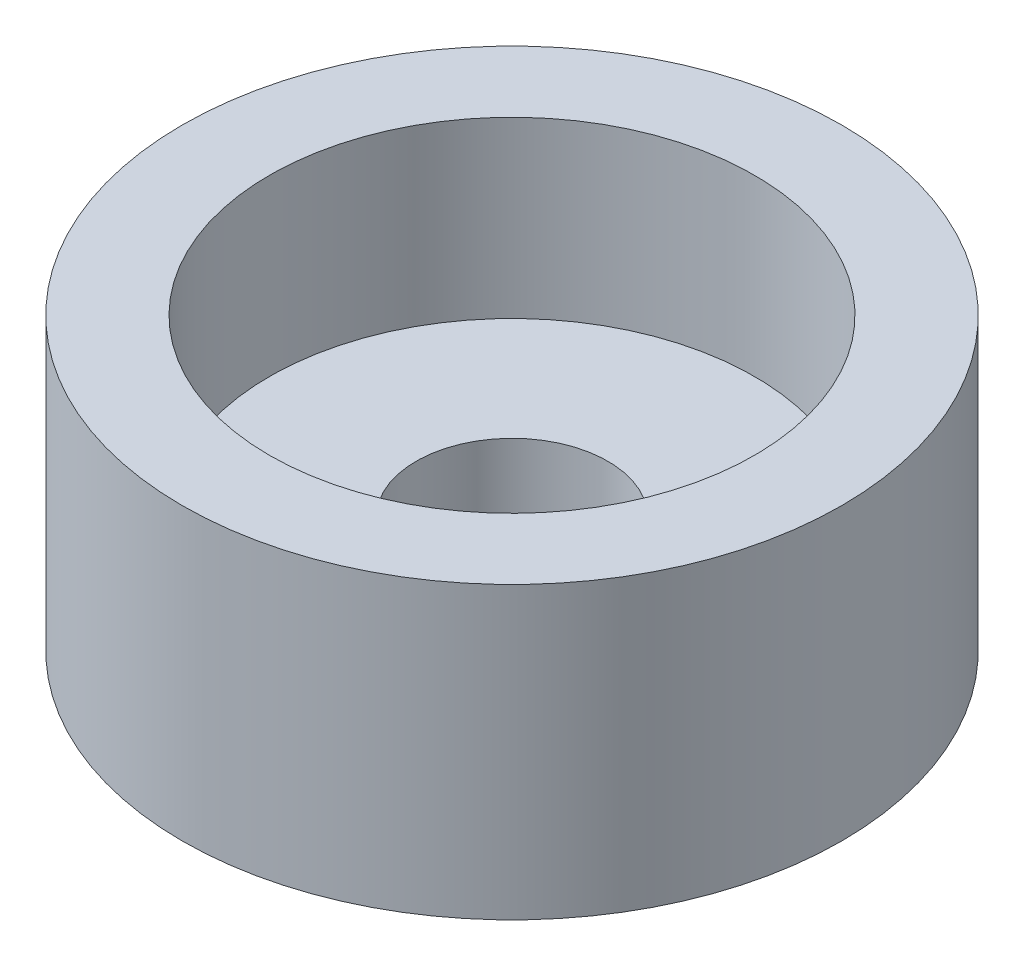
ISO-10303-21;
HEADER;
FILE_DESCRIPTION(('STEP AP214'),'2;1');
FILE_NAME('part.step','',(''),(''),'','','');
FILE_SCHEMA(('AUTOMOTIVE_DESIGN { 1 0 10303 214 1 1 1 1 }'));
ENDSEC;
DATA;
#1=APPLICATION_CONTEXT('core data for automotive mechanical design processes');
#2=APPLICATION_PROTOCOL_DEFINITION('international standard','automotive_design',2000,#1);
#3=PRODUCT_CONTEXT('',#1,'mechanical');
#4=PRODUCT('Part','Part','',(#3));
#5=PRODUCT_RELATED_PRODUCT_CATEGORY('part','',(#4));
#6=PRODUCT_DEFINITION_FORMATION('','',#4);
#7=PRODUCT_DEFINITION_CONTEXT('part definition',#1,'design');
#8=PRODUCT_DEFINITION('design','',#6,#7);
#9=PRODUCT_DEFINITION_SHAPE('','',#8);
#10=(LENGTH_UNIT() NAMED_UNIT(*) SI_UNIT(.MILLI.,.METRE.));
#11=(NAMED_UNIT(*) PLANE_ANGLE_UNIT() SI_UNIT($,.RADIAN.));
#12=(NAMED_UNIT(*) SI_UNIT($,.STERADIAN.) SOLID_ANGLE_UNIT());
#13=UNCERTAINTY_MEASURE_WITH_UNIT(LENGTH_MEASURE(1.E-05),#10,'distance_accuracy_value','');
#14=(GEOMETRIC_REPRESENTATION_CONTEXT(3) GLOBAL_UNCERTAINTY_ASSIGNED_CONTEXT((#13)) GLOBAL_UNIT_ASSIGNED_CONTEXT((#10,
#11,#12)) REPRESENTATION_CONTEXT('',''));
#15=CARTESIAN_POINT('',(0.,0.,0.));
#16=DIRECTION('',(0.,0.,1.));
#17=DIRECTION('',(1.,0.,0.));
#18=AXIS2_PLACEMENT_3D('',#15,#16,#17);
#19=CARTESIAN_POINT('',(0.,2.,0.));
#20=DIRECTION('',(0.,1.,0.));
#21=DIRECTION('',(0.,0.,1.));
#22=AXIS2_PLACEMENT_3D('',#19,#20,#21);
#23=PLANE('',#22);
#24=CARTESIAN_POINT('',(0.,2.,0.));
#25=DIRECTION('',(0.,1.,0.));
#26=DIRECTION('',(0.,0.,1.));
#27=AXIS2_PLACEMENT_3D('',#24,#25,#26);
#28=CIRCLE('',#27,1.65);
#29=CARTESIAN_POINT('',(0.,2.,1.65));
#30=VERTEX_POINT('',#29);
#31=EDGE_CURVE('E41',#30,#30,#28,.T.);
#32=ORIENTED_EDGE('',*,*,#31,.F.);
#33=EDGE_LOOP('',(#32));
#34=FACE_BOUND('',#33,.T.);
#35=CARTESIAN_POINT('',(0.,2.,0.));
#36=DIRECTION('',(0.,1.,0.));
#37=DIRECTION('',(0.,0.,1.));
#38=AXIS2_PLACEMENT_3D('',#35,#36,#37);
#39=CIRCLE('',#38,4.175);
#40=CARTESIAN_POINT('',(0.,2.,4.175));
#41=VERTEX_POINT('',#40);
#42=EDGE_CURVE('E10',#41,#41,#39,.F.);
#43=ORIENTED_EDGE('',*,*,#42,.F.);
#44=EDGE_LOOP('',(#43));
#45=FACE_BOUND('',#44,.T.);
#46=ADVANCED_FACE('F30',(#34,#45),#23,.T.);
#47=CARTESIAN_POINT('',(0.,0.,0.));
#48=DIRECTION('',(0.,1.,0.));
#49=DIRECTION('',(0.,0.,1.));
#50=AXIS2_PLACEMENT_3D('',#47,#48,#49);
#51=PLANE('',#50);
#52=CARTESIAN_POINT('',(0.,0.,0.));
#53=DIRECTION('',(0.,1.,0.));
#54=DIRECTION('',(0.,0.,1.));
#55=AXIS2_PLACEMENT_3D('',#52,#53,#54);
#56=CIRCLE('',#55,5.675);
#57=CARTESIAN_POINT('',(0.,0.,5.675));
#58=VERTEX_POINT('',#57);
#59=EDGE_CURVE('E37',#58,#58,#56,.T.);
#60=ORIENTED_EDGE('',*,*,#59,.F.);
#61=EDGE_LOOP('',(#60));
#62=FACE_BOUND('',#61,.T.);
#63=CARTESIAN_POINT('',(0.,0.,0.));
#64=DIRECTION('',(0.,1.,0.));
#65=DIRECTION('',(0.,0.,1.));
#66=AXIS2_PLACEMENT_3D('',#63,#64,#65);
#67=CIRCLE('',#66,1.65);
#68=CARTESIAN_POINT('',(0.,0.,1.65));
#69=VERTEX_POINT('',#68);
#70=EDGE_CURVE('E45',#69,#69,#67,.T.);
#71=ORIENTED_EDGE('',*,*,#70,.T.);
#72=EDGE_LOOP('',(#71));
#73=FACE_BOUND('',#72,.T.);
#74=ADVANCED_FACE('F72',(#62,#73),#51,.F.);
#75=CARTESIAN_POINT('',(0.,2.,0.));
#76=DIRECTION('',(0.,-1.,0.));
#77=DIRECTION('',(0.,0.,-1.));
#78=AXIS2_PLACEMENT_3D('',#75,#76,#77);
#79=CYLINDRICAL_SURFACE('',#78,5.675);
#80=ORIENTED_EDGE('',*,*,#59,.T.);
#81=EDGE_LOOP('',(#80));
#82=FACE_BOUND('',#81,.T.);
#83=CARTESIAN_POINT('',(0.,5.,0.));
#84=DIRECTION('',(0.,1.,0.));
#85=DIRECTION('',(0.,0.,1.));
#86=AXIS2_PLACEMENT_3D('',#83,#84,#85);
#87=CIRCLE('',#86,5.675);
#88=CARTESIAN_POINT('',(0.,5.,5.675));
#89=VERTEX_POINT('',#88);
#90=EDGE_CURVE('E49',#89,#89,#87,.T.);
#91=ORIENTED_EDGE('',*,*,#90,.F.);
#92=EDGE_LOOP('',(#91));
#93=FACE_BOUND('',#92,.T.);
#94=ADVANCED_FACE('F32',(#82,#93),#79,.T.);
#95=CARTESIAN_POINT('',(0.,2.,0.));
#96=DIRECTION('',(0.,-1.,0.));
#97=DIRECTION('',(0.,0.,-1.));
#98=AXIS2_PLACEMENT_3D('',#95,#96,#97);
#99=CYLINDRICAL_SURFACE('',#98,1.65);
#100=ORIENTED_EDGE('',*,*,#31,.T.);
#101=EDGE_LOOP('',(#100));
#102=FACE_BOUND('',#101,.T.);
#103=ORIENTED_EDGE('',*,*,#70,.F.);
#104=EDGE_LOOP('',(#103));
#105=FACE_BOUND('',#104,.T.);
#106=ADVANCED_FACE('F61',(#102,#105),#99,.F.);
#107=CARTESIAN_POINT('',(0.,5.,0.));
#108=DIRECTION('',(0.,1.,0.));
#109=DIRECTION('',(0.,0.,1.));
#110=AXIS2_PLACEMENT_3D('',#107,#108,#109);
#111=PLANE('',#110);
#112=ORIENTED_EDGE('',*,*,#90,.T.);
#113=EDGE_LOOP('',(#112));
#114=FACE_BOUND('',#113,.T.);
#115=CARTESIAN_POINT('',(0.,5.,0.));
#116=DIRECTION('',(0.,1.,0.));
#117=DIRECTION('',(0.,0.,1.));
#118=AXIS2_PLACEMENT_3D('',#115,#116,#117);
#119=CIRCLE('',#118,4.175);
#120=CARTESIAN_POINT('',(0.,5.,4.175));
#121=VERTEX_POINT('',#120);
#122=EDGE_CURVE('E53',#121,#121,#119,.T.);
#123=ORIENTED_EDGE('',*,*,#122,.F.);
#124=EDGE_LOOP('',(#123));
#125=FACE_BOUND('',#124,.T.);
#126=ADVANCED_FACE('F59',(#114,#125),#111,.T.);
#127=CARTESIAN_POINT('',(0.,5.,0.));
#128=DIRECTION('',(0.,-1.,0.));
#129=DIRECTION('',(0.,0.,-1.));
#130=AXIS2_PLACEMENT_3D('',#127,#128,#129);
#131=CYLINDRICAL_SURFACE('',#130,4.175);
#132=ORIENTED_EDGE('',*,*,#122,.T.);
#133=EDGE_LOOP('',(#132));
#134=FACE_BOUND('',#133,.T.);
#135=ORIENTED_EDGE('',*,*,#42,.T.);
#136=EDGE_LOOP('',(#135));
#137=FACE_BOUND('',#136,.T.);
#138=ADVANCED_FACE('F57',(#134,#137),#131,.F.);
#139=CLOSED_SHELL('',(#46,#74,#94,#106,#126,#138));
#140=MANIFOLD_SOLID_BREP('B2',#139);
#141=ADVANCED_BREP_SHAPE_REPRESENTATION('',(#18,#140),#14);
#142=SHAPE_DEFINITION_REPRESENTATION(#9,#141);
ENDSEC;
END-ISO-10303-21;
